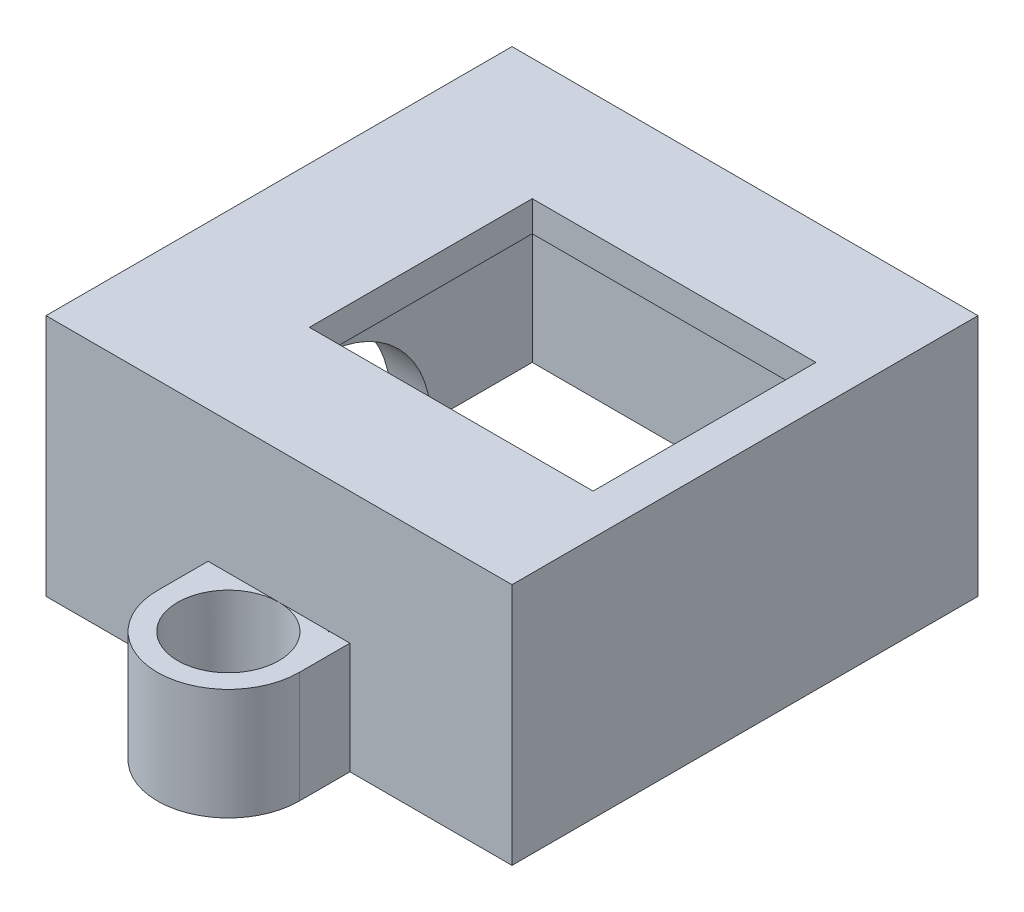
ISO-10303-21;
HEADER;
FILE_DESCRIPTION(('STEP AP214'),'2;1');
FILE_NAME('part.step','',(''),(''),'','','');
FILE_SCHEMA(('AUTOMOTIVE_DESIGN { 1 0 10303 214 1 1 1 1 }'));
ENDSEC;
DATA;
#1=APPLICATION_CONTEXT('core data for automotive mechanical design processes');
#2=APPLICATION_PROTOCOL_DEFINITION('international standard','automotive_design',2000,#1);
#3=PRODUCT_CONTEXT('',#1,'mechanical');
#4=PRODUCT('Part','Part','',(#3));
#5=PRODUCT_RELATED_PRODUCT_CATEGORY('part','',(#4));
#6=PRODUCT_DEFINITION_FORMATION('','',#4);
#7=PRODUCT_DEFINITION_CONTEXT('part definition',#1,'design');
#8=PRODUCT_DEFINITION('design','',#6,#7);
#9=PRODUCT_DEFINITION_SHAPE('','',#8);
#10=(LENGTH_UNIT() NAMED_UNIT(*) SI_UNIT(.MILLI.,.METRE.));
#11=(NAMED_UNIT(*) PLANE_ANGLE_UNIT() SI_UNIT($,.RADIAN.));
#12=(NAMED_UNIT(*) SI_UNIT($,.STERADIAN.) SOLID_ANGLE_UNIT());
#13=UNCERTAINTY_MEASURE_WITH_UNIT(LENGTH_MEASURE(1.E-05),#10,'distance_accuracy_value','');
#14=(GEOMETRIC_REPRESENTATION_CONTEXT(3) GLOBAL_UNCERTAINTY_ASSIGNED_CONTEXT((#13)) GLOBAL_UNIT_ASSIGNED_CONTEXT((#10,
#11,#12)) REPRESENTATION_CONTEXT('',''));
#15=CARTESIAN_POINT('',(0.,0.,0.));
#16=DIRECTION('',(0.,0.,1.));
#17=DIRECTION('',(1.,0.,0.));
#18=AXIS2_PLACEMENT_3D('',#15,#16,#17);
#19=CARTESIAN_POINT('',(19.,10.,0.));
#20=DIRECTION('',(-1.,0.,0.));
#21=DIRECTION('',(0.,0.,1.));
#22=AXIS2_PLACEMENT_3D('',#19,#20,#21);
#23=PLANE('',#22);
#24=DIRECTION('',(0.,-1.,0.));
#25=VECTOR('',#24,1.);
#26=CARTESIAN_POINT('',(19.,10.,-21.));
#27=LINE('',#26,#25);
#28=CARTESIAN_POINT('',(19.,10.,-21.));
#29=VERTEX_POINT('',#28);
#30=CARTESIAN_POINT('',(19.,-11.,-21.));
#31=VERTEX_POINT('',#30);
#32=EDGE_CURVE('E426',#29,#31,#27,.T.);
#33=ORIENTED_EDGE('',*,*,#32,.T.);
#34=DIRECTION('',(0.,0.,-1.));
#35=VECTOR('',#34,1.);
#36=CARTESIAN_POINT('',(19.,-11.,0.));
#37=LINE('',#36,#35);
#38=CARTESIAN_POINT('',(19.,-11.,21.));
#39=VERTEX_POINT('',#38);
#40=EDGE_CURVE('E249',#39,#31,#37,.T.);
#41=ORIENTED_EDGE('',*,*,#40,.F.);
#42=DIRECTION('',(0.,-1.,0.));
#43=VECTOR('',#42,1.);
#44=CARTESIAN_POINT('',(19.,10.,21.));
#45=LINE('',#44,#43);
#46=CARTESIAN_POINT('',(19.,10.,21.));
#47=VERTEX_POINT('',#46);
#48=EDGE_CURVE('E219',#47,#39,#45,.T.);
#49=ORIENTED_EDGE('',*,*,#48,.F.);
#50=DIRECTION('',(0.,0.,-1.));
#51=VECTOR('',#50,1.);
#52=CARTESIAN_POINT('',(19.,10.,0.));
#53=LINE('',#52,#51);
#54=CARTESIAN_POINT('',(19.,10.,11.));
#55=VERTEX_POINT('',#54);
#56=EDGE_CURVE('E400',#47,#55,#53,.T.);
#57=ORIENTED_EDGE('',*,*,#56,.T.);
#58=DIRECTION('',(0.,-1.,0.));
#59=VECTOR('',#58,1.);
#60=CARTESIAN_POINT('',(19.,13.,11.));
#61=LINE('',#60,#59);
#62=CARTESIAN_POINT('',(19.,13.,11.));
#63=VERTEX_POINT('',#62);
#64=EDGE_CURVE('E392',#63,#55,#61,.T.);
#65=ORIENTED_EDGE('',*,*,#64,.F.);
#66=DIRECTION('',(0.,0.,1.));
#67=VECTOR('',#66,1.);
#68=CARTESIAN_POINT('',(19.,13.,0.));
#69=LINE('',#68,#67);
#70=CARTESIAN_POINT('',(19.,13.,-11.));
#71=VERTEX_POINT('',#70);
#72=EDGE_CURVE('E348',#71,#63,#69,.T.);
#73=ORIENTED_EDGE('',*,*,#72,.F.);
#74=DIRECTION('',(0.,-1.,0.));
#75=VECTOR('',#74,1.);
#76=CARTESIAN_POINT('',(19.,13.,-11.));
#77=LINE('',#76,#75);
#78=CARTESIAN_POINT('',(19.,10.,-11.));
#79=VERTEX_POINT('',#78);
#80=EDGE_CURVE('E395',#71,#79,#77,.T.);
#81=ORIENTED_EDGE('',*,*,#80,.T.);
#82=EDGE_CURVE('E405',#79,#29,#53,.T.);
#83=ORIENTED_EDGE('',*,*,#82,.T.);
#84=EDGE_LOOP('',(#33,#41,#49,#57,#65,#73,#81,#83));
#85=FACE_BOUND('',#84,.T.);
#86=ADVANCED_FACE('F41',(#85),#23,.T.);
#87=CARTESIAN_POINT('',(0.,10.,21.));
#88=DIRECTION('',(0.,0.,-1.));
#89=DIRECTION('',(-1.,0.,0.));
#90=AXIS2_PLACEMENT_3D('',#87,#88,#89);
#91=PLANE('',#90);
#92=ORIENTED_EDGE('',*,*,#48,.T.);
#93=DIRECTION('',(1.,0.,0.));
#94=VECTOR('',#93,1.);
#95=CARTESIAN_POINT('',(0.,-11.,21.));
#96=LINE('',#95,#94);
#97=CARTESIAN_POINT('',(-19.,-11.,21.));
#98=VERTEX_POINT('',#97);
#99=EDGE_CURVE('E253',#98,#39,#96,.T.);
#100=ORIENTED_EDGE('',*,*,#99,.F.);
#101=DIRECTION('',(0.,-1.,0.));
#102=VECTOR('',#101,1.);
#103=CARTESIAN_POINT('',(-19.,10.,21.));
#104=LINE('',#103,#102);
#105=CARTESIAN_POINT('',(-19.,10.,21.));
#106=VERTEX_POINT('',#105);
#107=EDGE_CURVE('E433',#106,#98,#104,.T.);
#108=ORIENTED_EDGE('',*,*,#107,.F.);
#109=DIRECTION('',(1.,0.,0.));
#110=VECTOR('',#109,1.);
#111=CARTESIAN_POINT('',(0.,10.,21.));
#112=LINE('',#111,#110);
#113=EDGE_CURVE('E404',#106,#47,#112,.T.);
#114=ORIENTED_EDGE('',*,*,#113,.T.);
#115=EDGE_LOOP('',(#92,#100,#108,#114));
#116=FACE_BOUND('',#115,.T.);
#117=ADVANCED_FACE('F551',(#116),#91,.T.);
#118=CARTESIAN_POINT('',(-19.,10.,0.));
#119=DIRECTION('',(1.,0.,0.));
#120=DIRECTION('',(0.,0.,-1.));
#121=AXIS2_PLACEMENT_3D('',#118,#119,#120);
#122=PLANE('',#121);
#123=CARTESIAN_POINT('',(-19.,-11.,0.));
#124=DIRECTION('',(1.,0.,0.));
#125=DIRECTION('',(0.,0.,-1.));
#126=AXIS2_PLACEMENT_3D('',#123,#124,#125);
#127=CIRCLE('',#126,11.);
#128=CARTESIAN_POINT('',(-19.,-11.,-11.));
#129=VERTEX_POINT('',#128);
#130=CARTESIAN_POINT('',(-19.,-11.,11.));
#131=VERTEX_POINT('',#130);
#132=EDGE_CURVE('E57',#129,#131,#127,.T.);
#133=ORIENTED_EDGE('',*,*,#132,.F.);
#134=DIRECTION('',(0.,0.,1.));
#135=VECTOR('',#134,1.);
#136=CARTESIAN_POINT('',(-19.,-11.,0.));
#137=LINE('',#136,#135);
#138=CARTESIAN_POINT('',(-19.,-11.,-21.));
#139=VERTEX_POINT('',#138);
#140=EDGE_CURVE('E258',#139,#129,#137,.T.);
#141=ORIENTED_EDGE('',*,*,#140,.F.);
#142=DIRECTION('',(0.,-1.,0.));
#143=VECTOR('',#142,1.);
#144=CARTESIAN_POINT('',(-19.,10.,-21.));
#145=LINE('',#144,#143);
#146=CARTESIAN_POINT('',(-19.,10.,-21.));
#147=VERTEX_POINT('',#146);
#148=EDGE_CURVE('E429',#147,#139,#145,.T.);
#149=ORIENTED_EDGE('',*,*,#148,.F.);
#150=DIRECTION('',(0.,0.,1.));
#151=VECTOR('',#150,1.);
#152=CARTESIAN_POINT('',(-19.,10.,0.));
#153=LINE('',#152,#151);
#154=EDGE_CURVE('E65',#147,#106,#153,.T.);
#155=ORIENTED_EDGE('',*,*,#154,.T.);
#156=ORIENTED_EDGE('',*,*,#107,.T.);
#157=EDGE_CURVE('E257',#131,#98,#137,.T.);
#158=ORIENTED_EDGE('',*,*,#157,.F.);
#159=EDGE_LOOP('',(#133,#141,#149,#155,#156,#158));
#160=FACE_BOUND('',#159,.T.);
#161=ADVANCED_FACE('F557',(#160),#122,.T.);
#162=CARTESIAN_POINT('',(0.,10.,23.));
#163=DIRECTION('',(0.,0.,-1.));
#164=DIRECTION('',(-1.,0.,0.));
#165=AXIS2_PLACEMENT_3D('',#162,#163,#164);
#166=PLANE('',#165);
#167=DIRECTION('',(0.,-1.,0.));
#168=VECTOR('',#167,1.);
#169=CARTESIAN_POINT('',(-23.,10.,23.));
#170=LINE('',#169,#168);
#171=CARTESIAN_POINT('',(-23.,13.,23.));
#172=VERTEX_POINT('',#171);
#173=CARTESIAN_POINT('',(-23.,-11.,23.));
#174=VERTEX_POINT('',#173);
#175=EDGE_CURVE('E415',#172,#174,#170,.T.);
#176=ORIENTED_EDGE('',*,*,#175,.T.);
#177=DIRECTION('',(1.,0.,0.));
#178=VECTOR('',#177,1.);
#179=CARTESIAN_POINT('',(0.,-11.,23.));
#180=LINE('',#179,#178);
#181=CARTESIAN_POINT('',(-7.,-11.,23.));
#182=VERTEX_POINT('',#181);
#183=EDGE_CURVE('E234',#174,#182,#180,.T.);
#184=ORIENTED_EDGE('',*,*,#183,.T.);
#185=DIRECTION('',(0.,1.,0.));
#186=VECTOR('',#185,1.);
#187=CARTESIAN_POINT('',(-7.,-11.,23.));
#188=LINE('',#187,#186);
#189=CARTESIAN_POINT('',(-7.,0.,23.));
#190=VERTEX_POINT('',#189);
#191=EDGE_CURVE('E331',#182,#190,#188,.T.);
#192=ORIENTED_EDGE('',*,*,#191,.T.);
#193=DIRECTION('',(1.,0.,0.));
#194=VECTOR('',#193,1.);
#195=CARTESIAN_POINT('',(0.,0.,23.));
#196=LINE('',#195,#194);
#197=CARTESIAN_POINT('',(0.,0.,23.));
#198=VERTEX_POINT('',#197);
#199=EDGE_CURVE('E420',#190,#198,#196,.T.);
#200=ORIENTED_EDGE('',*,*,#199,.T.);
#201=CARTESIAN_POINT('',(4.89897948556635,0.,23.));
#202=VERTEX_POINT('',#201);
#203=EDGE_CURVE('E419',#198,#202,#196,.T.);
#204=ORIENTED_EDGE('',*,*,#203,.T.);
#205=DIRECTION('',(0.,1.,0.));
#206=VECTOR('',#205,1.);
#207=CARTESIAN_POINT('',(4.89897948556635,-11.,23.));
#208=LINE('',#207,#206);
#209=CARTESIAN_POINT('',(4.89897948556635,-11.,23.));
#210=VERTEX_POINT('',#209);
#211=EDGE_CURVE('E265',#210,#202,#208,.T.);
#212=ORIENTED_EDGE('',*,*,#211,.F.);
#213=DIRECTION('',(1.,0.,0.));
#214=VECTOR('',#213,1.);
#215=CARTESIAN_POINT('',(0.,-11.,23.));
#216=LINE('',#215,#214);
#217=CARTESIAN_POINT('',(5.,-11.,23.));
#218=VERTEX_POINT('',#217);
#219=EDGE_CURVE('E615',#210,#218,#216,.T.);
#220=ORIENTED_EDGE('',*,*,#219,.T.);
#221=DIRECTION('',(0.,1.,0.));
#222=VECTOR('',#221,1.);
#223=CARTESIAN_POINT('',(5.,-11.,23.));
#224=LINE('',#223,#222);
#225=CARTESIAN_POINT('',(5.,0.,23.));
#226=VERTEX_POINT('',#225);
#227=EDGE_CURVE('E338',#218,#226,#224,.T.);
#228=ORIENTED_EDGE('',*,*,#227,.T.);
#229=CARTESIAN_POINT('',(7.,0.,23.));
#230=VERTEX_POINT('',#229);
#231=EDGE_CURVE('E399',#226,#230,#196,.T.);
#232=ORIENTED_EDGE('',*,*,#231,.T.);
#233=DIRECTION('',(0.,1.,0.));
#234=VECTOR('',#233,1.);
#235=CARTESIAN_POINT('',(7.,-11.,23.));
#236=LINE('',#235,#234);
#237=CARTESIAN_POINT('',(7.,-11.,23.));
#238=VERTEX_POINT('',#237);
#239=EDGE_CURVE('E322',#238,#230,#236,.T.);
#240=ORIENTED_EDGE('',*,*,#239,.F.);
#241=DIRECTION('',(1.,0.,0.));
#242=VECTOR('',#241,1.);
#243=CARTESIAN_POINT('',(0.,-11.,23.));
#244=LINE('',#243,#242);
#245=CARTESIAN_POINT('',(23.,-11.,23.));
#246=VERTEX_POINT('',#245);
#247=EDGE_CURVE('E460',#238,#246,#244,.T.);
#248=ORIENTED_EDGE('',*,*,#247,.T.);
#249=DIRECTION('',(0.,-1.,0.));
#250=VECTOR('',#249,1.);
#251=CARTESIAN_POINT('',(23.,10.,23.));
#252=LINE('',#251,#250);
#253=CARTESIAN_POINT('',(23.,13.,23.));
#254=VERTEX_POINT('',#253);
#255=EDGE_CURVE('E430',#254,#246,#252,.T.);
#256=ORIENTED_EDGE('',*,*,#255,.F.);
#257=DIRECTION('',(1.,0.,0.));
#258=VECTOR('',#257,1.);
#259=CARTESIAN_POINT('',(0.,13.,23.));
#260=LINE('',#259,#258);
#261=EDGE_CURVE('E364',#172,#254,#260,.T.);
#262=ORIENTED_EDGE('',*,*,#261,.F.);
#263=EDGE_LOOP('',(#176,#184,#192,#200,#204,#212,#220,#228,#232,#240,#248,#256,#262));
#264=FACE_BOUND('',#263,.T.);
#265=ADVANCED_FACE('F43',(#264),#166,.F.);
#266=CARTESIAN_POINT('',(23.,10.,0.));
#267=DIRECTION('',(-1.,0.,0.));
#268=DIRECTION('',(0.,0.,1.));
#269=AXIS2_PLACEMENT_3D('',#266,#267,#268);
#270=PLANE('',#269);
#271=ORIENTED_EDGE('',*,*,#255,.T.);
#272=DIRECTION('',(0.,0.,-1.));
#273=VECTOR('',#272,1.);
#274=CARTESIAN_POINT('',(23.,-11.,0.));
#275=LINE('',#274,#273);
#276=CARTESIAN_POINT('',(23.,-11.,-23.));
#277=VERTEX_POINT('',#276);
#278=EDGE_CURVE('E453',#246,#277,#275,.T.);
#279=ORIENTED_EDGE('',*,*,#278,.T.);
#280=DIRECTION('',(0.,-1.,0.));
#281=VECTOR('',#280,1.);
#282=CARTESIAN_POINT('',(23.,10.,-23.));
#283=LINE('',#282,#281);
#284=CARTESIAN_POINT('',(23.,13.,-23.));
#285=VERTEX_POINT('',#284);
#286=EDGE_CURVE('E444',#285,#277,#283,.T.);
#287=ORIENTED_EDGE('',*,*,#286,.F.);
#288=DIRECTION('',(0.,0.,-1.));
#289=VECTOR('',#288,1.);
#290=CARTESIAN_POINT('',(23.,13.,0.));
#291=LINE('',#290,#289);
#292=EDGE_CURVE('E368',#254,#285,#291,.T.);
#293=ORIENTED_EDGE('',*,*,#292,.F.);
#294=EDGE_LOOP('',(#271,#279,#287,#293));
#295=FACE_BOUND('',#294,.T.);
#296=ADVANCED_FACE('F452',(#295),#270,.F.);
#297=CARTESIAN_POINT('',(0.,10.,-23.));
#298=DIRECTION('',(0.,0.,1.));
#299=DIRECTION('',(1.,0.,0.));
#300=AXIS2_PLACEMENT_3D('',#297,#298,#299);
#301=PLANE('',#300);
#302=ORIENTED_EDGE('',*,*,#286,.T.);
#303=DIRECTION('',(-1.,0.,0.));
#304=VECTOR('',#303,1.);
#305=CARTESIAN_POINT('',(0.,-11.,-23.));
#306=LINE('',#305,#304);
#307=CARTESIAN_POINT('',(7.00000000000002,-11.,-23.));
#308=VERTEX_POINT('',#307);
#309=EDGE_CURVE('E463',#277,#308,#306,.T.);
#310=ORIENTED_EDGE('',*,*,#309,.T.);
#311=DIRECTION('',(0.,1.,0.));
#312=VECTOR('',#311,1.);
#313=CARTESIAN_POINT('',(7.00000000000002,-11.,-23.));
#314=LINE('',#313,#312);
#315=CARTESIAN_POINT('',(7.00000000000002,0.,-23.));
#316=VERTEX_POINT('',#315);
#317=EDGE_CURVE('E318',#308,#316,#314,.T.);
#318=ORIENTED_EDGE('',*,*,#317,.T.);
#319=DIRECTION('',(-1.,0.,0.));
#320=VECTOR('',#319,1.);
#321=CARTESIAN_POINT('',(0.,0.,-23.));
#322=LINE('',#321,#320);
#323=CARTESIAN_POINT('',(0.,0.,-23.));
#324=VERTEX_POINT('',#323);
#325=EDGE_CURVE('E425',#316,#324,#322,.T.);
#326=ORIENTED_EDGE('',*,*,#325,.T.);
#327=CARTESIAN_POINT('',(-6.99999999999998,0.,-23.));
#328=VERTEX_POINT('',#327);
#329=EDGE_CURVE('E421',#324,#328,#322,.T.);
#330=ORIENTED_EDGE('',*,*,#329,.T.);
#331=DIRECTION('',(0.,1.,0.));
#332=VECTOR('',#331,1.);
#333=CARTESIAN_POINT('',(-6.99999999999998,-11.,-23.));
#334=LINE('',#333,#332);
#335=CARTESIAN_POINT('',(-6.99999999999998,-11.,-23.));
#336=VERTEX_POINT('',#335);
#337=EDGE_CURVE('E307',#336,#328,#334,.T.);
#338=ORIENTED_EDGE('',*,*,#337,.F.);
#339=DIRECTION('',(-1.,0.,0.));
#340=VECTOR('',#339,1.);
#341=CARTESIAN_POINT('',(0.,-11.,-23.));
#342=LINE('',#341,#340);
#343=CARTESIAN_POINT('',(-23.,-11.,-23.));
#344=VERTEX_POINT('',#343);
#345=EDGE_CURVE('E236',#336,#344,#342,.T.);
#346=ORIENTED_EDGE('',*,*,#345,.T.);
#347=DIRECTION('',(0.,-1.,0.));
#348=VECTOR('',#347,1.);
#349=CARTESIAN_POINT('',(-23.,10.,-23.));
#350=LINE('',#349,#348);
#351=CARTESIAN_POINT('',(-23.,13.,-23.));
#352=VERTEX_POINT('',#351);
#353=EDGE_CURVE('E441',#352,#344,#350,.T.);
#354=ORIENTED_EDGE('',*,*,#353,.F.);
#355=DIRECTION('',(-1.,0.,0.));
#356=VECTOR('',#355,1.);
#357=CARTESIAN_POINT('',(0.,13.,-23.));
#358=LINE('',#357,#356);
#359=EDGE_CURVE('E372',#285,#352,#358,.T.);
#360=ORIENTED_EDGE('',*,*,#359,.F.);
#361=EDGE_LOOP('',(#302,#310,#318,#326,#330,#338,#346,#354,#360));
#362=FACE_BOUND('',#361,.T.);
#363=ADVANCED_FACE('F492',(#362),#301,.F.);
#364=CARTESIAN_POINT('',(-23.,10.,0.));
#365=DIRECTION('',(1.,0.,0.));
#366=DIRECTION('',(0.,0.,-1.));
#367=AXIS2_PLACEMENT_3D('',#364,#365,#366);
#368=PLANE('',#367);
#369=DIRECTION('',(0.,0.,1.));
#370=VECTOR('',#369,1.);
#371=CARTESIAN_POINT('',(-23.,-11.,0.));
#372=LINE('',#371,#370);
#373=CARTESIAN_POINT('',(-23.,-11.,-11.));
#374=VERTEX_POINT('',#373);
#375=EDGE_CURVE('E226',#344,#374,#372,.T.);
#376=ORIENTED_EDGE('',*,*,#375,.T.);
#377=CARTESIAN_POINT('',(-23.,-11.,0.));
#378=DIRECTION('',(-1.,0.,0.));
#379=DIRECTION('',(0.,0.,1.));
#380=AXIS2_PLACEMENT_3D('',#377,#378,#379);
#381=CIRCLE('',#380,11.);
#382=CARTESIAN_POINT('',(-23.,-11.,11.));
#383=VERTEX_POINT('',#382);
#384=EDGE_CURVE('E214',#383,#374,#381,.T.);
#385=ORIENTED_EDGE('',*,*,#384,.F.);
#386=EDGE_CURVE('E223',#383,#174,#372,.T.);
#387=ORIENTED_EDGE('',*,*,#386,.T.);
#388=ORIENTED_EDGE('',*,*,#175,.F.);
#389=DIRECTION('',(0.,0.,1.));
#390=VECTOR('',#389,1.);
#391=CARTESIAN_POINT('',(-23.,13.,0.));
#392=LINE('',#391,#390);
#393=EDGE_CURVE('E360',#352,#172,#392,.T.);
#394=ORIENTED_EDGE('',*,*,#393,.F.);
#395=ORIENTED_EDGE('',*,*,#353,.T.);
#396=EDGE_LOOP('',(#376,#385,#387,#388,#394,#395));
#397=FACE_BOUND('',#396,.T.);
#398=ADVANCED_FACE('F222',(#397),#368,.F.);
#399=CARTESIAN_POINT('',(0.,10.,-21.));
#400=DIRECTION('',(0.,0.,1.));
#401=DIRECTION('',(1.,0.,0.));
#402=AXIS2_PLACEMENT_3D('',#399,#400,#401);
#403=PLANE('',#402);
#404=ORIENTED_EDGE('',*,*,#148,.T.);
#405=DIRECTION('',(-1.,0.,0.));
#406=VECTOR('',#405,1.);
#407=CARTESIAN_POINT('',(0.,-11.,-21.));
#408=LINE('',#407,#406);
#409=EDGE_CURVE('E261',#31,#139,#408,.T.);
#410=ORIENTED_EDGE('',*,*,#409,.F.);
#411=ORIENTED_EDGE('',*,*,#32,.F.);
#412=DIRECTION('',(-1.,0.,0.));
#413=VECTOR('',#412,1.);
#414=CARTESIAN_POINT('',(0.,10.,-21.));
#415=LINE('',#414,#413);
#416=EDGE_CURVE('E411',#29,#147,#415,.T.);
#417=ORIENTED_EDGE('',*,*,#416,.T.);
#418=EDGE_LOOP('',(#404,#410,#411,#417));
#419=FACE_BOUND('',#418,.T.);
#420=ADVANCED_FACE('F564',(#419),#403,.T.);
#421=CARTESIAN_POINT('',(0.,13.,-11.));
#422=DIRECTION('',(0.,0.,-1.));
#423=DIRECTION('',(-1.,0.,0.));
#424=AXIS2_PLACEMENT_3D('',#421,#422,#423);
#425=PLANE('',#424);
#426=DIRECTION('',(1.,0.,0.));
#427=VECTOR('',#426,1.);
#428=CARTESIAN_POINT('',(0.,10.,-11.));
#429=LINE('',#428,#427);
#430=CARTESIAN_POINT('',(-8.99999999999999,10.,-11.));
#431=VERTEX_POINT('',#430);
#432=EDGE_CURVE('E310',#431,#79,#429,.T.);
#433=ORIENTED_EDGE('',*,*,#432,.T.);
#434=ORIENTED_EDGE('',*,*,#80,.F.);
#435=DIRECTION('',(1.,0.,0.));
#436=VECTOR('',#435,1.);
#437=CARTESIAN_POINT('',(0.,13.,-11.));
#438=LINE('',#437,#436);
#439=CARTESIAN_POINT('',(-8.99999999999999,13.,-11.));
#440=VERTEX_POINT('',#439);
#441=EDGE_CURVE('E344',#440,#71,#438,.T.);
#442=ORIENTED_EDGE('',*,*,#441,.F.);
#443=DIRECTION('',(0.,-1.,0.));
#444=VECTOR('',#443,1.);
#445=CARTESIAN_POINT('',(-8.99999999999999,13.,-11.));
#446=LINE('',#445,#444);
#447=EDGE_CURVE('E376',#440,#431,#446,.T.);
#448=ORIENTED_EDGE('',*,*,#447,.T.);
#449=EDGE_LOOP('',(#433,#434,#442,#448));
#450=FACE_BOUND('',#449,.T.);
#451=ADVANCED_FACE('F579',(#450),#425,.F.);
#452=CARTESIAN_POINT('',(0.,13.,11.));
#453=DIRECTION('',(0.,0.,-1.));
#454=DIRECTION('',(-1.,0.,0.));
#455=AXIS2_PLACEMENT_3D('',#452,#453,#454);
#456=PLANE('',#455);
#457=DIRECTION('',(1.,0.,0.));
#458=VECTOR('',#457,1.);
#459=CARTESIAN_POINT('',(0.,10.,11.));
#460=LINE('',#459,#458);
#461=CARTESIAN_POINT('',(-8.99999999999999,10.,11.));
#462=VERTEX_POINT('',#461);
#463=EDGE_CURVE('E380',#462,#55,#460,.T.);
#464=ORIENTED_EDGE('',*,*,#463,.F.);
#465=DIRECTION('',(0.,-1.,0.));
#466=VECTOR('',#465,1.);
#467=CARTESIAN_POINT('',(-8.99999999999999,13.,11.));
#468=LINE('',#467,#466);
#469=CARTESIAN_POINT('',(-8.99999999999999,13.,11.));
#470=VERTEX_POINT('',#469);
#471=EDGE_CURVE('E389',#470,#462,#468,.T.);
#472=ORIENTED_EDGE('',*,*,#471,.F.);
#473=DIRECTION('',(1.,0.,0.));
#474=VECTOR('',#473,1.);
#475=CARTESIAN_POINT('',(0.,13.,11.));
#476=LINE('',#475,#474);
#477=EDGE_CURVE('E352',#470,#63,#476,.T.);
#478=ORIENTED_EDGE('',*,*,#477,.T.);
#479=ORIENTED_EDGE('',*,*,#64,.T.);
#480=EDGE_LOOP('',(#464,#472,#478,#479));
#481=FACE_BOUND('',#480,.T.);
#482=ADVANCED_FACE('F583',(#481),#456,.T.);
#483=CARTESIAN_POINT('',(-8.99999999999999,13.,0.));
#484=DIRECTION('',(1.,0.,0.));
#485=DIRECTION('',(0.,0.,-1.));
#486=AXIS2_PLACEMENT_3D('',#483,#484,#485);
#487=PLANE('',#486);
#488=DIRECTION('',(0.,0.,1.));
#489=VECTOR('',#488,1.);
#490=CARTESIAN_POINT('',(-8.99999999999999,10.,0.));
#491=LINE('',#490,#489);
#492=EDGE_CURVE('E349',#431,#462,#491,.T.);
#493=ORIENTED_EDGE('',*,*,#492,.F.);
#494=ORIENTED_EDGE('',*,*,#447,.F.);
#495=DIRECTION('',(0.,0.,1.));
#496=VECTOR('',#495,1.);
#497=CARTESIAN_POINT('',(-8.99999999999999,13.,0.));
#498=LINE('',#497,#496);
#499=EDGE_CURVE('E356',#440,#470,#498,.T.);
#500=ORIENTED_EDGE('',*,*,#499,.T.);
#501=ORIENTED_EDGE('',*,*,#471,.T.);
#502=EDGE_LOOP('',(#493,#494,#500,#501));
#503=FACE_BOUND('',#502,.T.);
#504=ADVANCED_FACE('F587',(#503),#487,.T.);
#505=CARTESIAN_POINT('',(0.,13.,0.));
#506=DIRECTION('',(0.,1.,0.));
#507=DIRECTION('',(0.,0.,1.));
#508=AXIS2_PLACEMENT_3D('',#505,#506,#507);
#509=PLANE('',#508);
#510=ORIENTED_EDGE('',*,*,#441,.T.);
#511=ORIENTED_EDGE('',*,*,#72,.T.);
#512=ORIENTED_EDGE('',*,*,#477,.F.);
#513=ORIENTED_EDGE('',*,*,#499,.F.);
#514=EDGE_LOOP('',(#510,#511,#512,#513));
#515=FACE_BOUND('',#514,.T.);
#516=ORIENTED_EDGE('',*,*,#393,.T.);
#517=ORIENTED_EDGE('',*,*,#261,.T.);
#518=ORIENTED_EDGE('',*,*,#292,.T.);
#519=ORIENTED_EDGE('',*,*,#359,.T.);
#520=EDGE_LOOP('',(#516,#517,#518,#519));
#521=FACE_BOUND('',#520,.T.);
#522=ADVANCED_FACE('F505',(#515,#521),#509,.T.);
#523=CARTESIAN_POINT('',(0.,10.,0.));
#524=DIRECTION('',(0.,1.,0.));
#525=DIRECTION('',(0.,0.,1.));
#526=AXIS2_PLACEMENT_3D('',#523,#524,#525);
#527=PLANE('',#526);
#528=ORIENTED_EDGE('',*,*,#56,.F.);
#529=ORIENTED_EDGE('',*,*,#113,.F.);
#530=ORIENTED_EDGE('',*,*,#154,.F.);
#531=ORIENTED_EDGE('',*,*,#416,.F.);
#532=ORIENTED_EDGE('',*,*,#82,.F.);
#533=ORIENTED_EDGE('',*,*,#432,.F.);
#534=ORIENTED_EDGE('',*,*,#492,.T.);
#535=ORIENTED_EDGE('',*,*,#463,.T.);
#536=EDGE_LOOP('',(#528,#529,#530,#531,#532,#533,#534,#535));
#537=FACE_BOUND('',#536,.T.);
#538=ADVANCED_FACE('F592',(#537),#527,.F.);
#539=CARTESIAN_POINT('',(0.,0.,0.));
#540=DIRECTION('',(0.,1.,0.));
#541=DIRECTION('',(0.,0.,1.));
#542=AXIS2_PLACEMENT_3D('',#539,#540,#541);
#543=PLANE('',#542);
#544=ORIENTED_EDGE('',*,*,#199,.F.);
#545=DIRECTION('',(0.,0.,-1.));
#546=VECTOR('',#545,1.);
#547=CARTESIAN_POINT('',(-7.00000000000001,0.,0.));
#548=LINE('',#547,#546);
#549=CARTESIAN_POINT('',(-6.99999999999999,0.,28.));
#550=VERTEX_POINT('',#549);
#551=EDGE_CURVE('E278',#550,#190,#548,.T.);
#552=ORIENTED_EDGE('',*,*,#551,.F.);
#553=CARTESIAN_POINT('',(0.,0.,28.));
#554=DIRECTION('',(0.,1.,0.));
#555=DIRECTION('',(0.,0.,1.));
#556=AXIS2_PLACEMENT_3D('',#553,#554,#555);
#557=CIRCLE('',#556,7.);
#558=CARTESIAN_POINT('',(7.,0.,28.));
#559=VERTEX_POINT('',#558);
#560=EDGE_CURVE('E282',#550,#559,#557,.T.);
#561=ORIENTED_EDGE('',*,*,#560,.T.);
#562=DIRECTION('',(0.,0.,-1.));
#563=VECTOR('',#562,1.);
#564=CARTESIAN_POINT('',(6.99999999999999,0.,0.));
#565=LINE('',#564,#563);
#566=EDGE_CURVE('E286',#559,#230,#565,.T.);
#567=ORIENTED_EDGE('',*,*,#566,.T.);
#568=ORIENTED_EDGE('',*,*,#231,.F.);
#569=DIRECTION('',(0.,0.,-1.));
#570=VECTOR('',#569,1.);
#571=CARTESIAN_POINT('',(5.,0.,0.));
#572=LINE('',#571,#570);
#573=CARTESIAN_POINT('',(5.,0.,23.1010205144336));
#574=VERTEX_POINT('',#573);
#575=EDGE_CURVE('E270',#574,#226,#572,.T.);
#576=ORIENTED_EDGE('',*,*,#575,.F.);
#577=CARTESIAN_POINT('',(0.,0.,28.));
#578=DIRECTION('',(0.,1.,0.));
#579=DIRECTION('',(0.,0.,1.));
#580=AXIS2_PLACEMENT_3D('',#577,#578,#579);
#581=CIRCLE('',#580,7.);
#582=EDGE_CURVE('E266',#574,#202,#581,.T.);
#583=ORIENTED_EDGE('',*,*,#582,.T.);
#584=ORIENTED_EDGE('',*,*,#203,.F.);
#585=CARTESIAN_POINT('',(0.,0.,28.));
#586=DIRECTION('',(0.,1.,0.));
#587=DIRECTION('',(0.,0.,1.));
#588=AXIS2_PLACEMENT_3D('',#585,#586,#587);
#589=CIRCLE('',#588,5.);
#590=EDGE_CURVE('E274',#198,#198,#589,.T.);
#591=ORIENTED_EDGE('',*,*,#590,.F.);
#592=EDGE_LOOP('',(#544,#552,#561,#567,#568,#576,#583,#584,#591));
#593=FACE_BOUND('',#592,.T.);
#594=ADVANCED_FACE('F532',(#593),#543,.T.);
#595=ORIENTED_EDGE('',*,*,#325,.F.);
#596=DIRECTION('',(0.,0.,1.));
#597=VECTOR('',#596,1.);
#598=CARTESIAN_POINT('',(6.99999999999999,0.,0.));
#599=LINE('',#598,#597);
#600=CARTESIAN_POINT('',(7.00000000000002,0.,-28.));
#601=VERTEX_POINT('',#600);
#602=EDGE_CURVE('E290',#601,#316,#599,.T.);
#603=ORIENTED_EDGE('',*,*,#602,.F.);
#604=CARTESIAN_POINT('',(0.,0.,-28.));
#605=DIRECTION('',(0.,1.,0.));
#606=DIRECTION('',(0.,0.,1.));
#607=AXIS2_PLACEMENT_3D('',#604,#605,#606);
#608=CIRCLE('',#607,7.);
#609=CARTESIAN_POINT('',(-6.99999999999997,0.,-28.));
#610=VERTEX_POINT('',#609);
#611=EDGE_CURVE('E294',#610,#601,#608,.F.);
#612=ORIENTED_EDGE('',*,*,#611,.F.);
#613=DIRECTION('',(0.,0.,1.));
#614=VECTOR('',#613,1.);
#615=CARTESIAN_POINT('',(-7.00000000000001,0.,0.));
#616=LINE('',#615,#614);
#617=EDGE_CURVE('E298',#610,#328,#616,.T.);
#618=ORIENTED_EDGE('',*,*,#617,.T.);
#619=ORIENTED_EDGE('',*,*,#329,.F.);
#620=CARTESIAN_POINT('',(0.,0.,-28.));
#621=DIRECTION('',(0.,1.,0.));
#622=DIRECTION('',(0.,0.,1.));
#623=AXIS2_PLACEMENT_3D('',#620,#621,#622);
#624=CIRCLE('',#623,5.);
#625=EDGE_CURVE('E302',#324,#324,#624,.F.);
#626=ORIENTED_EDGE('',*,*,#625,.T.);
#627=EDGE_LOOP('',(#595,#603,#612,#618,#619,#626));
#628=FACE_BOUND('',#627,.T.);
#629=ADVANCED_FACE('F496',(#628),#543,.T.);
#630=CARTESIAN_POINT('',(-7.00000000000001,-11.,0.));
#631=DIRECTION('',(-1.,0.,0.));
#632=DIRECTION('',(0.,0.,1.));
#633=AXIS2_PLACEMENT_3D('',#630,#631,#632);
#634=PLANE('',#633);
#635=ORIENTED_EDGE('',*,*,#617,.F.);
#636=DIRECTION('',(0.,1.,0.));
#637=VECTOR('',#636,1.);
#638=CARTESIAN_POINT('',(-6.99999999999997,-11.,-28.));
#639=LINE('',#638,#637);
#640=CARTESIAN_POINT('',(-6.99999999999997,-11.,-28.));
#641=VERTEX_POINT('',#640);
#642=EDGE_CURVE('E311',#641,#610,#639,.T.);
#643=ORIENTED_EDGE('',*,*,#642,.F.);
#644=DIRECTION('',(0.,0.,1.));
#645=VECTOR('',#644,1.);
#646=CARTESIAN_POINT('',(-7.00000000000001,-11.,0.));
#647=LINE('',#646,#645);
#648=EDGE_CURVE('E242',#641,#336,#647,.T.);
#649=ORIENTED_EDGE('',*,*,#648,.T.);
#650=ORIENTED_EDGE('',*,*,#337,.T.);
#651=EDGE_LOOP('',(#635,#643,#649,#650));
#652=FACE_BOUND('',#651,.T.);
#653=ADVANCED_FACE('F487',(#652),#634,.T.);
#654=CARTESIAN_POINT('',(0.,-11.,-28.));
#655=DIRECTION('',(0.,1.,0.));
#656=DIRECTION('',(0.,0.,1.));
#657=AXIS2_PLACEMENT_3D('',#654,#655,#656);
#658=CYLINDRICAL_SURFACE('',#657,7.);
#659=ORIENTED_EDGE('',*,*,#611,.T.);
#660=DIRECTION('',(0.,1.,0.));
#661=VECTOR('',#660,1.);
#662=CARTESIAN_POINT('',(7.00000000000002,-11.,-28.));
#663=LINE('',#662,#661);
#664=CARTESIAN_POINT('',(7.00000000000002,-11.,-28.));
#665=VERTEX_POINT('',#664);
#666=EDGE_CURVE('E314',#665,#601,#663,.T.);
#667=ORIENTED_EDGE('',*,*,#666,.F.);
#668=CARTESIAN_POINT('',(0.,-11.,-28.));
#669=DIRECTION('',(0.,1.,0.));
#670=DIRECTION('',(0.,0.,1.));
#671=AXIS2_PLACEMENT_3D('',#668,#669,#670);
#672=CIRCLE('',#671,7.);
#673=EDGE_CURVE('E479',#641,#665,#672,.F.);
#674=ORIENTED_EDGE('',*,*,#673,.F.);
#675=ORIENTED_EDGE('',*,*,#642,.T.);
#676=EDGE_LOOP('',(#659,#667,#674,#675));
#677=FACE_BOUND('',#676,.T.);
#678=ADVANCED_FACE('F500',(#677),#658,.T.);
#679=CARTESIAN_POINT('',(6.99999999999999,-11.,0.));
#680=DIRECTION('',(-1.,0.,0.));
#681=DIRECTION('',(0.,0.,1.));
#682=AXIS2_PLACEMENT_3D('',#679,#680,#681);
#683=PLANE('',#682);
#684=ORIENTED_EDGE('',*,*,#602,.T.);
#685=ORIENTED_EDGE('',*,*,#317,.F.);
#686=DIRECTION('',(0.,0.,1.));
#687=VECTOR('',#686,1.);
#688=CARTESIAN_POINT('',(6.99999999999999,-11.,0.));
#689=LINE('',#688,#687);
#690=EDGE_CURVE('E476',#665,#308,#689,.T.);
#691=ORIENTED_EDGE('',*,*,#690,.F.);
#692=ORIENTED_EDGE('',*,*,#666,.T.);
#693=EDGE_LOOP('',(#684,#685,#691,#692));
#694=FACE_BOUND('',#693,.T.);
#695=ADVANCED_FACE('F502',(#694),#683,.F.);
#696=CARTESIAN_POINT('',(6.99999999999999,-11.,0.));
#697=DIRECTION('',(1.,0.,0.));
#698=DIRECTION('',(0.,0.,-1.));
#699=AXIS2_PLACEMENT_3D('',#696,#697,#698);
#700=PLANE('',#699);
#701=ORIENTED_EDGE('',*,*,#566,.F.);
#702=DIRECTION('',(0.,1.,0.));
#703=VECTOR('',#702,1.);
#704=CARTESIAN_POINT('',(7.,-11.,28.));
#705=LINE('',#704,#703);
#706=CARTESIAN_POINT('',(7.,-11.,28.));
#707=VERTEX_POINT('',#706);
#708=EDGE_CURVE('E325',#707,#559,#705,.T.);
#709=ORIENTED_EDGE('',*,*,#708,.F.);
#710=DIRECTION('',(0.,0.,-1.));
#711=VECTOR('',#710,1.);
#712=CARTESIAN_POINT('',(6.99999999999999,-11.,0.));
#713=LINE('',#712,#711);
#714=EDGE_CURVE('E467',#707,#238,#713,.T.);
#715=ORIENTED_EDGE('',*,*,#714,.T.);
#716=ORIENTED_EDGE('',*,*,#239,.T.);
#717=EDGE_LOOP('',(#701,#709,#715,#716));
#718=FACE_BOUND('',#717,.T.);
#719=ADVANCED_FACE('F529',(#718),#700,.T.);
#720=CARTESIAN_POINT('',(0.,-11.,28.));
#721=DIRECTION('',(0.,1.,0.));
#722=DIRECTION('',(0.,0.,1.));
#723=AXIS2_PLACEMENT_3D('',#720,#721,#722);
#724=CYLINDRICAL_SURFACE('',#723,7.);
#725=ORIENTED_EDGE('',*,*,#560,.F.);
#726=DIRECTION('',(0.,1.,0.));
#727=VECTOR('',#726,1.);
#728=CARTESIAN_POINT('',(-6.99999999999999,-11.,28.));
#729=LINE('',#728,#727);
#730=CARTESIAN_POINT('',(-6.99999999999999,-11.,28.));
#731=VERTEX_POINT('',#730);
#732=EDGE_CURVE('E328',#731,#550,#729,.T.);
#733=ORIENTED_EDGE('',*,*,#732,.F.);
#734=CARTESIAN_POINT('',(0.,-11.,28.));
#735=DIRECTION('',(0.,1.,0.));
#736=DIRECTION('',(0.,0.,1.));
#737=AXIS2_PLACEMENT_3D('',#734,#735,#736);
#738=CIRCLE('',#737,7.);
#739=EDGE_CURVE('E470',#731,#707,#738,.T.);
#740=ORIENTED_EDGE('',*,*,#739,.T.);
#741=ORIENTED_EDGE('',*,*,#708,.T.);
#742=EDGE_LOOP('',(#725,#733,#740,#741));
#743=FACE_BOUND('',#742,.T.);
#744=ADVANCED_FACE('F525',(#743),#724,.T.);
#745=CARTESIAN_POINT('',(0.,-11.,28.));
#746=DIRECTION('',(0.,1.,0.));
#747=DIRECTION('',(0.,0.,1.));
#748=AXIS2_PLACEMENT_3D('',#745,#746,#747);
#749=CYLINDRICAL_SURFACE('',#748,7.);
#750=ORIENTED_EDGE('',*,*,#582,.F.);
#751=DIRECTION('',(0.,1.,0.));
#752=VECTOR('',#751,1.);
#753=CARTESIAN_POINT('',(5.,-11.,23.1010205144336));
#754=LINE('',#753,#752);
#755=CARTESIAN_POINT('',(5.,-11.,23.1010205144336));
#756=VERTEX_POINT('',#755);
#757=EDGE_CURVE('E335',#756,#574,#754,.T.);
#758=ORIENTED_EDGE('',*,*,#757,.F.);
#759=CARTESIAN_POINT('',(0.,-11.,28.));
#760=DIRECTION('',(0.,1.,0.));
#761=DIRECTION('',(0.,0.,1.));
#762=AXIS2_PLACEMENT_3D('',#759,#760,#761);
#763=CIRCLE('',#762,7.);
#764=EDGE_CURVE('E306',#756,#210,#763,.T.);
#765=ORIENTED_EDGE('',*,*,#764,.T.);
#766=ORIENTED_EDGE('',*,*,#211,.T.);
#767=EDGE_LOOP('',(#750,#758,#765,#766));
#768=FACE_BOUND('',#767,.T.);
#769=ADVANCED_FACE('F598',(#768),#749,.T.);
#770=CARTESIAN_POINT('',(5.,-11.,0.));
#771=DIRECTION('',(1.,0.,0.));
#772=DIRECTION('',(0.,0.,-1.));
#773=AXIS2_PLACEMENT_3D('',#770,#771,#772);
#774=PLANE('',#773);
#775=ORIENTED_EDGE('',*,*,#575,.T.);
#776=ORIENTED_EDGE('',*,*,#227,.F.);
#777=DIRECTION('',(0.,0.,-1.));
#778=VECTOR('',#777,1.);
#779=CARTESIAN_POINT('',(5.,-11.,0.));
#780=LINE('',#779,#778);
#781=EDGE_CURVE('E517',#756,#218,#780,.T.);
#782=ORIENTED_EDGE('',*,*,#781,.F.);
#783=ORIENTED_EDGE('',*,*,#757,.T.);
#784=EDGE_LOOP('',(#775,#776,#782,#783));
#785=FACE_BOUND('',#784,.T.);
#786=ADVANCED_FACE('F546',(#785),#774,.F.);
#787=CARTESIAN_POINT('',(0.,-11.,-28.));
#788=DIRECTION('',(0.,1.,0.));
#789=DIRECTION('',(0.,0.,1.));
#790=AXIS2_PLACEMENT_3D('',#787,#788,#789);
#791=CYLINDRICAL_SURFACE('',#790,5.);
#792=CARTESIAN_POINT('',(0.,-11.,-28.));
#793=DIRECTION('',(0.,1.,0.));
#794=DIRECTION('',(0.,0.,1.));
#795=AXIS2_PLACEMENT_3D('',#792,#793,#794);
#796=CIRCLE('',#795,5.);
#797=CARTESIAN_POINT('',(0.,-11.,-23.));
#798=VERTEX_POINT('',#797);
#799=EDGE_CURVE('E240',#798,#798,#796,.F.);
#800=ORIENTED_EDGE('',*,*,#799,.T.);
#801=EDGE_LOOP('',(#800));
#802=FACE_BOUND('',#801,.T.);
#803=ORIENTED_EDGE('',*,*,#625,.F.);
#804=EDGE_LOOP('',(#803));
#805=FACE_BOUND('',#804,.T.);
#806=ADVANCED_FACE('F538',(#802,#805),#791,.F.);
#807=CARTESIAN_POINT('',(-7.00000000000001,-11.,0.));
#808=DIRECTION('',(1.,0.,0.));
#809=DIRECTION('',(0.,0.,-1.));
#810=AXIS2_PLACEMENT_3D('',#807,#808,#809);
#811=PLANE('',#810);
#812=ORIENTED_EDGE('',*,*,#551,.T.);
#813=ORIENTED_EDGE('',*,*,#191,.F.);
#814=DIRECTION('',(0.,0.,-1.));
#815=VECTOR('',#814,1.);
#816=CARTESIAN_POINT('',(-7.00000000000001,-11.,0.));
#817=LINE('',#816,#815);
#818=EDGE_CURVE('E510',#731,#182,#817,.T.);
#819=ORIENTED_EDGE('',*,*,#818,.F.);
#820=ORIENTED_EDGE('',*,*,#732,.T.);
#821=EDGE_LOOP('',(#812,#813,#819,#820));
#822=FACE_BOUND('',#821,.T.);
#823=ADVANCED_FACE('F535',(#822),#811,.F.);
#824=CARTESIAN_POINT('',(0.,-11.,28.));
#825=DIRECTION('',(0.,1.,0.));
#826=DIRECTION('',(0.,0.,1.));
#827=AXIS2_PLACEMENT_3D('',#824,#825,#826);
#828=CYLINDRICAL_SURFACE('',#827,5.);
#829=CARTESIAN_POINT('',(0.,-11.,28.));
#830=DIRECTION('',(0.,1.,0.));
#831=DIRECTION('',(0.,0.,1.));
#832=AXIS2_PLACEMENT_3D('',#829,#830,#831);
#833=CIRCLE('',#832,5.);
#834=CARTESIAN_POINT('',(0.,-11.,33.));
#835=VERTEX_POINT('',#834);
#836=EDGE_CURVE('E511',#835,#835,#833,.T.);
#837=ORIENTED_EDGE('',*,*,#836,.F.);
#838=EDGE_LOOP('',(#837));
#839=FACE_BOUND('',#838,.T.);
#840=ORIENTED_EDGE('',*,*,#590,.T.);
#841=EDGE_LOOP('',(#840));
#842=FACE_BOUND('',#841,.T.);
#843=ADVANCED_FACE('F537',(#839,#842),#828,.F.);
#844=CARTESIAN_POINT('',(0.,-11.,0.));
#845=DIRECTION('',(0.,1.,0.));
#846=DIRECTION('',(0.,0.,1.));
#847=AXIS2_PLACEMENT_3D('',#844,#845,#846);
#848=PLANE('',#847);
#849=ORIENTED_EDGE('',*,*,#764,.F.);
#850=ORIENTED_EDGE('',*,*,#781,.T.);
#851=ORIENTED_EDGE('',*,*,#219,.F.);
#852=EDGE_LOOP('',(#849,#850,#851));
#853=FACE_BOUND('',#852,.T.);
#854=ORIENTED_EDGE('',*,*,#836,.T.);
#855=EDGE_LOOP('',(#854));
#856=FACE_BOUND('',#855,.T.);
#857=ORIENTED_EDGE('',*,*,#140,.T.);
#858=DIRECTION('',(-1.,0.,0.));
#859=VECTOR('',#858,1.);
#860=CARTESIAN_POINT('',(-12.,-11.,-11.));
#861=LINE('',#860,#859);
#862=EDGE_CURVE('E11',#129,#374,#861,.T.);
#863=ORIENTED_EDGE('',*,*,#862,.T.);
#864=ORIENTED_EDGE('',*,*,#375,.F.);
#865=ORIENTED_EDGE('',*,*,#345,.F.);
#866=ORIENTED_EDGE('',*,*,#648,.F.);
#867=ORIENTED_EDGE('',*,*,#673,.T.);
#868=ORIENTED_EDGE('',*,*,#690,.T.);
#869=ORIENTED_EDGE('',*,*,#309,.F.);
#870=ORIENTED_EDGE('',*,*,#278,.F.);
#871=ORIENTED_EDGE('',*,*,#247,.F.);
#872=ORIENTED_EDGE('',*,*,#714,.F.);
#873=ORIENTED_EDGE('',*,*,#739,.F.);
#874=ORIENTED_EDGE('',*,*,#818,.T.);
#875=ORIENTED_EDGE('',*,*,#183,.F.);
#876=ORIENTED_EDGE('',*,*,#386,.F.);
#877=DIRECTION('',(-1.,0.,0.));
#878=VECTOR('',#877,1.);
#879=CARTESIAN_POINT('',(-12.,-11.,11.));
#880=LINE('',#879,#878);
#881=EDGE_CURVE('E50',#383,#131,#880,.F.);
#882=ORIENTED_EDGE('',*,*,#881,.T.);
#883=ORIENTED_EDGE('',*,*,#157,.T.);
#884=ORIENTED_EDGE('',*,*,#99,.T.);
#885=ORIENTED_EDGE('',*,*,#40,.T.);
#886=ORIENTED_EDGE('',*,*,#409,.T.);
#887=EDGE_LOOP('',(#857,#863,#864,#865,#866,#867,#868,#869,#870,#871,#872,#873,#874,#875,#876,
#882,#883,#884,#885,#886));
#888=FACE_BOUND('',#887,.T.);
#889=ORIENTED_EDGE('',*,*,#799,.F.);
#890=EDGE_LOOP('',(#889));
#891=FACE_BOUND('',#890,.T.);
#892=ADVANCED_FACE('F231',(#853,#856,#888,#891),#848,.F.);
#893=CARTESIAN_POINT('',(-12.,-11.,0.));
#894=DIRECTION('',(-1.,0.,0.));
#895=DIRECTION('',(0.,0.,1.));
#896=AXIS2_PLACEMENT_3D('',#893,#894,#895);
#897=CYLINDRICAL_SURFACE('',#896,11.);
#898=ORIENTED_EDGE('',*,*,#132,.T.);
#899=ORIENTED_EDGE('',*,*,#881,.F.);
#900=ORIENTED_EDGE('',*,*,#384,.T.);
#901=ORIENTED_EDGE('',*,*,#862,.F.);
#902=EDGE_LOOP('',(#898,#899,#900,#901));
#903=FACE_BOUND('',#902,.T.);
#904=ADVANCED_FACE('F213',(#903),#897,.F.);
#905=CLOSED_SHELL('',(#86,#117,#161,#265,#296,#363,#398,#420,#451,#482,#504,#522,#538,#594,#629,
#653,#678,#695,#719,#744,#769,#786,#806,#823,#843,#892,#904));
#906=MANIFOLD_SOLID_BREP('B2',#905);
#907=ADVANCED_BREP_SHAPE_REPRESENTATION('',(#18,#906),#14);
#908=SHAPE_DEFINITION_REPRESENTATION(#9,#907);
ENDSEC;
END-ISO-10303-21;
